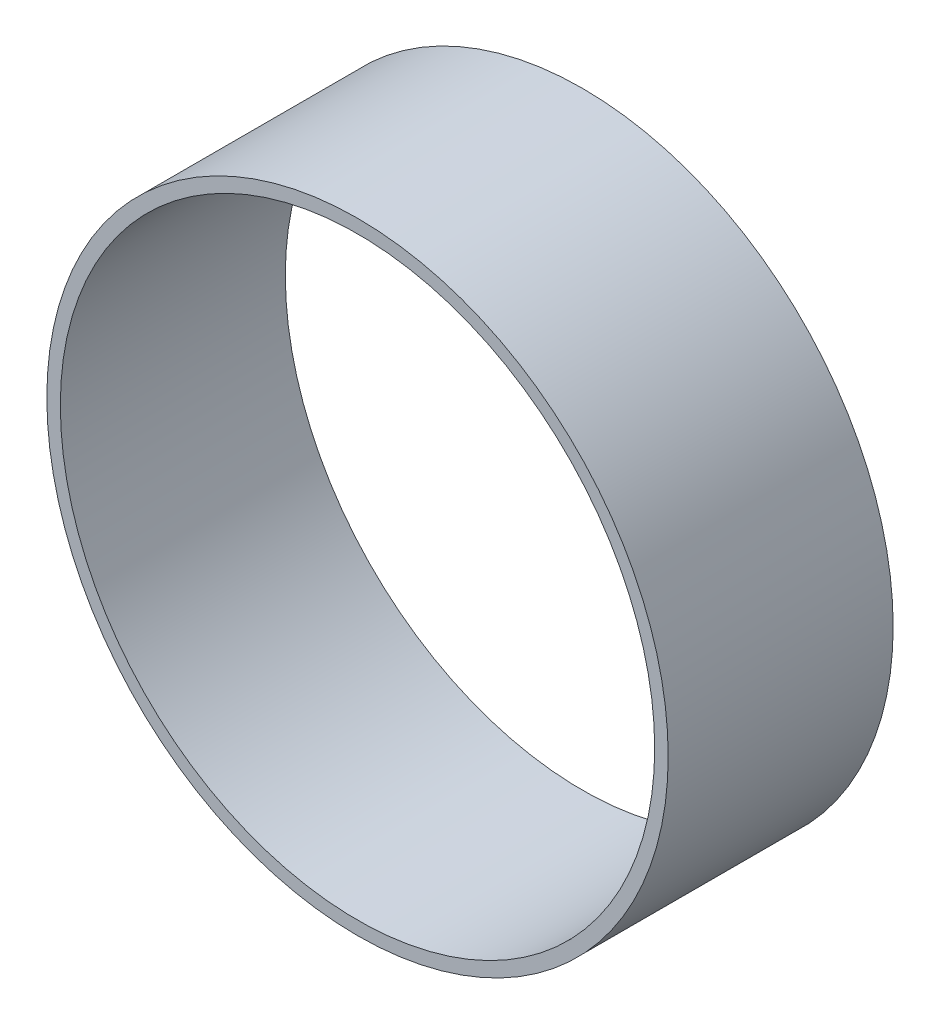
ISO-10303-21;
HEADER;
FILE_DESCRIPTION(('STEP AP214'),'2;1');
FILE_NAME('part.step','',(''),(''),'','','');
FILE_SCHEMA(('AUTOMOTIVE_DESIGN { 1 0 10303 214 1 1 1 1 }'));
ENDSEC;
DATA;
#1=APPLICATION_CONTEXT('core data for automotive mechanical design processes');
#2=APPLICATION_PROTOCOL_DEFINITION('international standard','automotive_design',2000,#1);
#3=PRODUCT_CONTEXT('',#1,'mechanical');
#4=PRODUCT('Part','Part','',(#3));
#5=PRODUCT_RELATED_PRODUCT_CATEGORY('part','',(#4));
#6=PRODUCT_DEFINITION_FORMATION('','',#4);
#7=PRODUCT_DEFINITION_CONTEXT('part definition',#1,'design');
#8=PRODUCT_DEFINITION('design','',#6,#7);
#9=PRODUCT_DEFINITION_SHAPE('','',#8);
#10=(LENGTH_UNIT() NAMED_UNIT(*) SI_UNIT(.MILLI.,.METRE.));
#11=(NAMED_UNIT(*) PLANE_ANGLE_UNIT() SI_UNIT($,.RADIAN.));
#12=(NAMED_UNIT(*) SI_UNIT($,.STERADIAN.) SOLID_ANGLE_UNIT());
#13=UNCERTAINTY_MEASURE_WITH_UNIT(LENGTH_MEASURE(1.E-05),#10,'distance_accuracy_value','');
#14=(GEOMETRIC_REPRESENTATION_CONTEXT(3) GLOBAL_UNCERTAINTY_ASSIGNED_CONTEXT((#13)) GLOBAL_UNIT_ASSIGNED_CONTEXT((#10,
#11,#12)) REPRESENTATION_CONTEXT('',''));
#15=CARTESIAN_POINT('',(0.,0.,0.));
#16=DIRECTION('',(0.,0.,1.));
#17=DIRECTION('',(1.,0.,0.));
#18=AXIS2_PLACEMENT_3D('',#15,#16,#17);
#19=CARTESIAN_POINT('',(0.,0.,50.));
#20=DIRECTION('',(0.,0.,1.));
#21=DIRECTION('',(1.,0.,0.));
#22=AXIS2_PLACEMENT_3D('',#19,#20,#21);
#23=PLANE('',#22);
#24=CARTESIAN_POINT('',(0.,0.,50.));
#25=DIRECTION('',(0.,0.,1.));
#26=DIRECTION('',(1.,0.,0.));
#27=AXIS2_PLACEMENT_3D('',#24,#25,#26);
#28=CIRCLE('',#27,69.05);
#29=CARTESIAN_POINT('',(69.05,0.,50.));
#30=VERTEX_POINT('',#29);
#31=EDGE_CURVE('E10',#30,#30,#28,.T.);
#32=ORIENTED_EDGE('',*,*,#31,.T.);
#33=EDGE_LOOP('',(#32));
#34=FACE_BOUND('',#33,.T.);
#35=CARTESIAN_POINT('',(0.,0.,50.));
#36=DIRECTION('',(0.,0.,1.));
#37=DIRECTION('',(1.,0.,0.));
#38=AXIS2_PLACEMENT_3D('',#35,#36,#37);
#39=CIRCLE('',#38,66.05);
#40=CARTESIAN_POINT('',(66.05,0.,50.));
#41=VERTEX_POINT('',#40);
#42=EDGE_CURVE('E50',#41,#41,#39,.T.);
#43=ORIENTED_EDGE('',*,*,#42,.F.);
#44=EDGE_LOOP('',(#43));
#45=FACE_BOUND('',#44,.T.);
#46=ADVANCED_FACE('F39',(#34,#45),#23,.T.);
#47=CARTESIAN_POINT('',(0.,0.,0.));
#48=DIRECTION('',(0.,0.,1.));
#49=DIRECTION('',(1.,0.,0.));
#50=AXIS2_PLACEMENT_3D('',#47,#48,#49);
#51=PLANE('',#50);
#52=CARTESIAN_POINT('',(0.,0.,0.));
#53=DIRECTION('',(0.,0.,1.));
#54=DIRECTION('',(1.,0.,0.));
#55=AXIS2_PLACEMENT_3D('',#52,#53,#54);
#56=CIRCLE('',#55,69.05);
#57=CARTESIAN_POINT('',(69.05,0.,0.));
#58=VERTEX_POINT('',#57);
#59=EDGE_CURVE('E43',#58,#58,#56,.T.);
#60=ORIENTED_EDGE('',*,*,#59,.F.);
#61=EDGE_LOOP('',(#60));
#62=FACE_BOUND('',#61,.T.);
#63=CARTESIAN_POINT('',(0.,0.,0.));
#64=DIRECTION('',(0.,0.,1.));
#65=DIRECTION('',(1.,0.,0.));
#66=AXIS2_PLACEMENT_3D('',#63,#64,#65);
#67=CIRCLE('',#66,66.05);
#68=CARTESIAN_POINT('',(66.05,0.,0.));
#69=VERTEX_POINT('',#68);
#70=EDGE_CURVE('E52',#69,#69,#67,.T.);
#71=ORIENTED_EDGE('',*,*,#70,.T.);
#72=EDGE_LOOP('',(#71));
#73=FACE_BOUND('',#72,.T.);
#74=ADVANCED_FACE('F62',(#62,#73),#51,.F.);
#75=CARTESIAN_POINT('',(0.,0.,50.));
#76=DIRECTION('',(0.,0.,-1.));
#77=DIRECTION('',(-1.,0.,0.));
#78=AXIS2_PLACEMENT_3D('',#75,#76,#77);
#79=CYLINDRICAL_SURFACE('',#78,69.05);
#80=ORIENTED_EDGE('',*,*,#31,.F.);
#81=EDGE_LOOP('',(#80));
#82=FACE_BOUND('',#81,.T.);
#83=ORIENTED_EDGE('',*,*,#59,.T.);
#84=EDGE_LOOP('',(#83));
#85=FACE_BOUND('',#84,.T.);
#86=ADVANCED_FACE('F41',(#82,#85),#79,.T.);
#87=CARTESIAN_POINT('',(0.,0.,50.));
#88=DIRECTION('',(0.,0.,-1.));
#89=DIRECTION('',(-1.,0.,0.));
#90=AXIS2_PLACEMENT_3D('',#87,#88,#89);
#91=CYLINDRICAL_SURFACE('',#90,66.05);
#92=ORIENTED_EDGE('',*,*,#42,.T.);
#93=EDGE_LOOP('',(#92));
#94=FACE_BOUND('',#93,.T.);
#95=ORIENTED_EDGE('',*,*,#70,.F.);
#96=EDGE_LOOP('',(#95));
#97=FACE_BOUND('',#96,.T.);
#98=ADVANCED_FACE('F58',(#94,#97),#91,.F.);
#99=CLOSED_SHELL('',(#46,#74,#86,#98));
#100=MANIFOLD_SOLID_BREP('B2',#99);
#101=ADVANCED_BREP_SHAPE_REPRESENTATION('',(#18,#100),#14);
#102=SHAPE_DEFINITION_REPRESENTATION(#9,#101);
ENDSEC;
END-ISO-10303-21;
